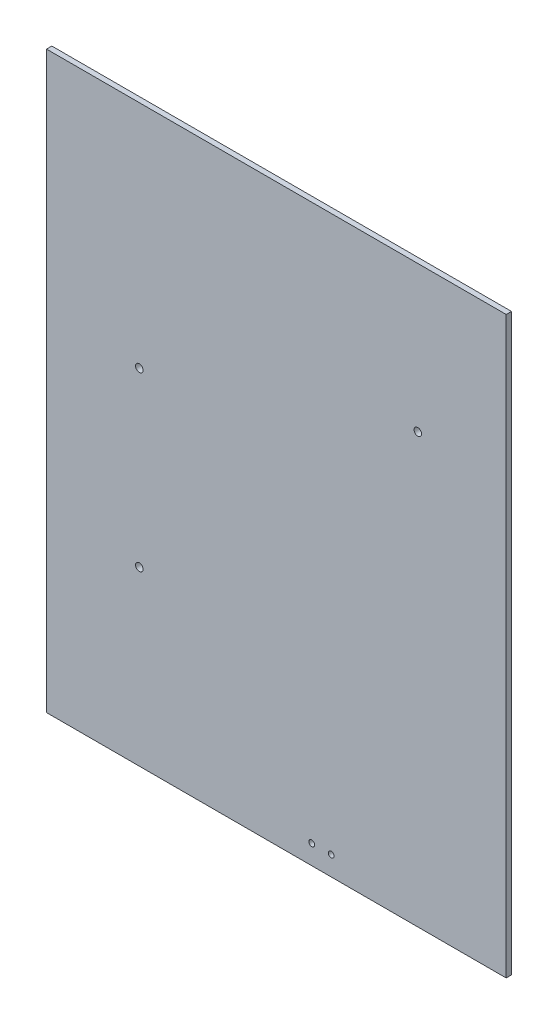
ISO-10303-21;
HEADER;
FILE_DESCRIPTION(('STEP AP214'),'2;1');
FILE_NAME('part.step','',(''),(''),'','','');
FILE_SCHEMA(('AUTOMOTIVE_DESIGN { 1 0 10303 214 1 1 1 1 }'));
ENDSEC;
DATA;
#1=APPLICATION_CONTEXT('core data for automotive mechanical design processes');
#2=APPLICATION_PROTOCOL_DEFINITION('international standard','automotive_design',2000,#1);
#3=PRODUCT_CONTEXT('',#1,'mechanical');
#4=PRODUCT('Part','Part','',(#3));
#5=PRODUCT_RELATED_PRODUCT_CATEGORY('part','',(#4));
#6=PRODUCT_DEFINITION_FORMATION('','',#4);
#7=PRODUCT_DEFINITION_CONTEXT('part definition',#1,'design');
#8=PRODUCT_DEFINITION('design','',#6,#7);
#9=PRODUCT_DEFINITION_SHAPE('','',#8);
#10=(LENGTH_UNIT() NAMED_UNIT(*) SI_UNIT(.MILLI.,.METRE.));
#11=(NAMED_UNIT(*) PLANE_ANGLE_UNIT() SI_UNIT($,.RADIAN.));
#12=(NAMED_UNIT(*) SI_UNIT($,.STERADIAN.) SOLID_ANGLE_UNIT());
#13=UNCERTAINTY_MEASURE_WITH_UNIT(LENGTH_MEASURE(1.E-05),#10,'distance_accuracy_value','');
#14=(GEOMETRIC_REPRESENTATION_CONTEXT(3) GLOBAL_UNCERTAINTY_ASSIGNED_CONTEXT((#13)) GLOBAL_UNIT_ASSIGNED_CONTEXT((#10,
#11,#12)) REPRESENTATION_CONTEXT('',''));
#15=CARTESIAN_POINT('',(0.,0.,0.));
#16=DIRECTION('',(0.,0.,1.));
#17=DIRECTION('',(1.,0.,0.));
#18=AXIS2_PLACEMENT_3D('',#15,#16,#17);
#19=CARTESIAN_POINT('',(0.,0.,6.));
#20=DIRECTION('',(1.,0.,0.));
#21=DIRECTION('',(0.,0.,-1.));
#22=AXIS2_PLACEMENT_3D('',#19,#20,#21);
#23=PLANE('',#22);
#24=DIRECTION('',(0.,-1.,0.));
#25=VECTOR('',#24,1.);
#26=CARTESIAN_POINT('',(0.,0.,0.));
#27=LINE('',#26,#25);
#28=CARTESIAN_POINT('',(0.,650.,0.));
#29=VERTEX_POINT('',#28);
#30=CARTESIAN_POINT('',(0.,0.,0.));
#31=VERTEX_POINT('',#30);
#32=EDGE_CURVE('E77',#29,#31,#27,.T.);
#33=ORIENTED_EDGE('',*,*,#32,.T.);
#34=DIRECTION('',(0.,0.,-1.));
#35=VECTOR('',#34,1.);
#36=CARTESIAN_POINT('',(0.,0.,6.));
#37=LINE('',#36,#35);
#38=CARTESIAN_POINT('',(0.,0.,6.));
#39=VERTEX_POINT('',#38);
#40=EDGE_CURVE('E11',#39,#31,#37,.T.);
#41=ORIENTED_EDGE('',*,*,#40,.F.);
#42=DIRECTION('',(0.,-1.,0.));
#43=VECTOR('',#42,1.);
#44=CARTESIAN_POINT('',(0.,0.,6.));
#45=LINE('',#44,#43);
#46=CARTESIAN_POINT('',(0.,650.,6.));
#47=VERTEX_POINT('',#46);
#48=EDGE_CURVE('E100',#47,#39,#45,.T.);
#49=ORIENTED_EDGE('',*,*,#48,.F.);
#50=DIRECTION('',(0.,0.,-1.));
#51=VECTOR('',#50,1.);
#52=CARTESIAN_POINT('',(0.,650.,6.));
#53=LINE('',#52,#51);
#54=EDGE_CURVE('E89',#47,#29,#53,.T.);
#55=ORIENTED_EDGE('',*,*,#54,.T.);
#56=EDGE_LOOP('',(#33,#41,#49,#55));
#57=FACE_BOUND('',#56,.T.);
#58=ADVANCED_FACE('F33',(#57),#23,.F.);
#59=CARTESIAN_POINT('',(0.,0.,6.));
#60=DIRECTION('',(0.,1.,0.));
#61=DIRECTION('',(0.,0.,1.));
#62=AXIS2_PLACEMENT_3D('',#59,#60,#61);
#63=PLANE('',#62);
#64=DIRECTION('',(1.,0.,0.));
#65=VECTOR('',#64,1.);
#66=CARTESIAN_POINT('',(0.,0.,0.));
#67=LINE('',#66,#65);
#68=CARTESIAN_POINT('',(520.,0.,0.));
#69=VERTEX_POINT('',#68);
#70=EDGE_CURVE('E73',#31,#69,#67,.T.);
#71=ORIENTED_EDGE('',*,*,#70,.T.);
#72=DIRECTION('',(0.,0.,-1.));
#73=VECTOR('',#72,1.);
#74=CARTESIAN_POINT('',(520.,0.,6.));
#75=LINE('',#74,#73);
#76=CARTESIAN_POINT('',(520.,0.,6.));
#77=VERTEX_POINT('',#76);
#78=EDGE_CURVE('E40',#77,#69,#75,.T.);
#79=ORIENTED_EDGE('',*,*,#78,.F.);
#80=DIRECTION('',(1.,0.,0.));
#81=VECTOR('',#80,1.);
#82=CARTESIAN_POINT('',(0.,0.,6.));
#83=LINE('',#82,#81);
#84=EDGE_CURVE('E85',#39,#77,#83,.T.);
#85=ORIENTED_EDGE('',*,*,#84,.F.);
#86=ORIENTED_EDGE('',*,*,#40,.T.);
#87=EDGE_LOOP('',(#71,#79,#85,#86));
#88=FACE_BOUND('',#87,.T.);
#89=ADVANCED_FACE('F84',(#88),#63,.F.);
#90=CARTESIAN_POINT('',(520.,0.,6.));
#91=DIRECTION('',(-1.,0.,0.));
#92=DIRECTION('',(0.,0.,1.));
#93=AXIS2_PLACEMENT_3D('',#90,#91,#92);
#94=PLANE('',#93);
#95=DIRECTION('',(0.,1.,0.));
#96=VECTOR('',#95,1.);
#97=CARTESIAN_POINT('',(520.,0.,0.));
#98=LINE('',#97,#96);
#99=CARTESIAN_POINT('',(520.,650.,0.));
#100=VERTEX_POINT('',#99);
#101=EDGE_CURVE('E78',#69,#100,#98,.T.);
#102=ORIENTED_EDGE('',*,*,#101,.T.);
#103=DIRECTION('',(0.,0.,-1.));
#104=VECTOR('',#103,1.);
#105=CARTESIAN_POINT('',(520.,650.,6.));
#106=LINE('',#105,#104);
#107=CARTESIAN_POINT('',(520.,650.,6.));
#108=VERTEX_POINT('',#107);
#109=EDGE_CURVE('E106',#108,#100,#106,.T.);
#110=ORIENTED_EDGE('',*,*,#109,.F.);
#111=DIRECTION('',(0.,1.,0.));
#112=VECTOR('',#111,1.);
#113=CARTESIAN_POINT('',(520.,0.,6.));
#114=LINE('',#113,#112);
#115=EDGE_CURVE('E52',#77,#108,#114,.T.);
#116=ORIENTED_EDGE('',*,*,#115,.F.);
#117=ORIENTED_EDGE('',*,*,#78,.T.);
#118=EDGE_LOOP('',(#102,#110,#116,#117));
#119=FACE_BOUND('',#118,.T.);
#120=ADVANCED_FACE('F109',(#119),#94,.F.);
#121=CARTESIAN_POINT('',(0.,650.,6.));
#122=DIRECTION('',(0.,-1.,0.));
#123=DIRECTION('',(0.,0.,-1.));
#124=AXIS2_PLACEMENT_3D('',#121,#122,#123);
#125=PLANE('',#124);
#126=DIRECTION('',(-1.,0.,0.));
#127=VECTOR('',#126,1.);
#128=CARTESIAN_POINT('',(0.,650.,0.));
#129=LINE('',#128,#127);
#130=EDGE_CURVE('E98',#100,#29,#129,.T.);
#131=ORIENTED_EDGE('',*,*,#130,.T.);
#132=ORIENTED_EDGE('',*,*,#54,.F.);
#133=DIRECTION('',(-1.,0.,0.));
#134=VECTOR('',#133,1.);
#135=CARTESIAN_POINT('',(0.,650.,6.));
#136=LINE('',#135,#134);
#137=EDGE_CURVE('E47',#108,#47,#136,.T.);
#138=ORIENTED_EDGE('',*,*,#137,.F.);
#139=ORIENTED_EDGE('',*,*,#109,.T.);
#140=EDGE_LOOP('',(#131,#132,#138,#139));
#141=FACE_BOUND('',#140,.T.);
#142=ADVANCED_FACE('F111',(#141),#125,.F.);
#143=CARTESIAN_POINT('',(0.,650.,6.));
#144=DIRECTION('',(0.,0.,-1.));
#145=DIRECTION('',(-1.,0.,0.));
#146=AXIS2_PLACEMENT_3D('',#143,#144,#145);
#147=PLANE('',#146);
#148=CARTESIAN_POINT('',(322.,22.,6.));
#149=DIRECTION('',(0.,0.,1.));
#150=DIRECTION('',(1.,0.,0.));
#151=AXIS2_PLACEMENT_3D('',#148,#149,#150);
#152=CIRCLE('',#151,3.24999999999995);
#153=CARTESIAN_POINT('',(325.25,22.,6.));
#154=VERTEX_POINT('',#153);
#155=EDGE_CURVE('E208',#154,#154,#152,.T.);
#156=ORIENTED_EDGE('',*,*,#155,.F.);
#157=EDGE_LOOP('',(#156));
#158=FACE_BOUND('',#157,.T.);
#159=CARTESIAN_POINT('',(300.,22.,6.));
#160=DIRECTION('',(0.,0.,1.));
#161=DIRECTION('',(1.,0.,0.));
#162=AXIS2_PLACEMENT_3D('',#159,#160,#161);
#163=CIRCLE('',#162,3.25000000000001);
#164=CARTESIAN_POINT('',(303.25,22.,6.));
#165=VERTEX_POINT('',#164);
#166=EDGE_CURVE('E212',#165,#165,#163,.T.);
#167=ORIENTED_EDGE('',*,*,#166,.F.);
#168=EDGE_LOOP('',(#167));
#169=FACE_BOUND('',#168,.T.);
#170=CARTESIAN_POINT('',(105.,195.,6.));
#171=DIRECTION('',(0.,0.,1.));
#172=DIRECTION('',(1.,0.,0.));
#173=AXIS2_PLACEMENT_3D('',#170,#171,#172);
#174=CIRCLE('',#173,4.25000000000001);
#175=CARTESIAN_POINT('',(109.25,195.,6.));
#176=VERTEX_POINT('',#175);
#177=EDGE_CURVE('E219',#176,#176,#174,.T.);
#178=ORIENTED_EDGE('',*,*,#177,.F.);
#179=EDGE_LOOP('',(#178));
#180=FACE_BOUND('',#179,.T.);
#181=CARTESIAN_POINT('',(105.,390.,6.));
#182=DIRECTION('',(0.,0.,1.));
#183=DIRECTION('',(1.,0.,0.));
#184=AXIS2_PLACEMENT_3D('',#181,#182,#183);
#185=CIRCLE('',#184,4.24999999999998);
#186=CARTESIAN_POINT('',(109.25,390.,6.));
#187=VERTEX_POINT('',#186);
#188=EDGE_CURVE('E225',#187,#187,#185,.T.);
#189=ORIENTED_EDGE('',*,*,#188,.F.);
#190=EDGE_LOOP('',(#189));
#191=FACE_BOUND('',#190,.T.);
#192=CARTESIAN_POINT('',(420.,485.,6.));
#193=DIRECTION('',(0.,0.,1.));
#194=DIRECTION('',(1.,0.,0.));
#195=AXIS2_PLACEMENT_3D('',#192,#193,#194);
#196=CIRCLE('',#195,4.24999999999995);
#197=CARTESIAN_POINT('',(424.25,485.,6.));
#198=VERTEX_POINT('',#197);
#199=EDGE_CURVE('E90',#198,#198,#196,.T.);
#200=ORIENTED_EDGE('',*,*,#199,.F.);
#201=EDGE_LOOP('',(#200));
#202=FACE_BOUND('',#201,.T.);
#203=ORIENTED_EDGE('',*,*,#48,.T.);
#204=ORIENTED_EDGE('',*,*,#84,.T.);
#205=ORIENTED_EDGE('',*,*,#115,.T.);
#206=ORIENTED_EDGE('',*,*,#137,.T.);
#207=EDGE_LOOP('',(#203,#204,#205,#206));
#208=FACE_BOUND('',#207,.T.);
#209=ADVANCED_FACE('F112',(#158,#169,#180,#191,#202,#208),#147,.F.);
#210=CARTESIAN_POINT('',(0.,650.,0.));
#211=DIRECTION('',(0.,0.,-1.));
#212=DIRECTION('',(-1.,0.,0.));
#213=AXIS2_PLACEMENT_3D('',#210,#211,#212);
#214=PLANE('',#213);
#215=CARTESIAN_POINT('',(322.,22.,0.));
#216=DIRECTION('',(0.,0.,-1.));
#217=DIRECTION('',(-1.,0.,0.));
#218=AXIS2_PLACEMENT_3D('',#215,#216,#217);
#219=CIRCLE('',#218,3.24999999999995);
#220=CARTESIAN_POINT('',(325.25,22.,0.));
#221=VERTEX_POINT('',#220);
#222=EDGE_CURVE('E206',#221,#221,#219,.F.);
#223=ORIENTED_EDGE('',*,*,#222,.T.);
#224=EDGE_LOOP('',(#223));
#225=FACE_BOUND('',#224,.T.);
#226=CARTESIAN_POINT('',(300.,22.,0.));
#227=DIRECTION('',(0.,0.,-1.));
#228=DIRECTION('',(-1.,0.,0.));
#229=AXIS2_PLACEMENT_3D('',#226,#227,#228);
#230=CIRCLE('',#229,3.25000000000001);
#231=CARTESIAN_POINT('',(303.25,22.,0.));
#232=VERTEX_POINT('',#231);
#233=EDGE_CURVE('E209',#232,#232,#230,.F.);
#234=ORIENTED_EDGE('',*,*,#233,.T.);
#235=EDGE_LOOP('',(#234));
#236=FACE_BOUND('',#235,.T.);
#237=CARTESIAN_POINT('',(105.,195.,0.));
#238=DIRECTION('',(0.,0.,-1.));
#239=DIRECTION('',(-1.,0.,0.));
#240=AXIS2_PLACEMENT_3D('',#237,#238,#239);
#241=CIRCLE('',#240,4.25000000000001);
#242=CARTESIAN_POINT('',(109.25,195.,0.));
#243=VERTEX_POINT('',#242);
#244=EDGE_CURVE('E217',#243,#243,#241,.F.);
#245=ORIENTED_EDGE('',*,*,#244,.T.);
#246=EDGE_LOOP('',(#245));
#247=FACE_BOUND('',#246,.T.);
#248=CARTESIAN_POINT('',(105.,390.,0.));
#249=DIRECTION('',(0.,0.,-1.));
#250=DIRECTION('',(-1.,0.,0.));
#251=AXIS2_PLACEMENT_3D('',#248,#249,#250);
#252=CIRCLE('',#251,4.24999999999998);
#253=CARTESIAN_POINT('',(109.25,390.,0.));
#254=VERTEX_POINT('',#253);
#255=EDGE_CURVE('E222',#254,#254,#252,.F.);
#256=ORIENTED_EDGE('',*,*,#255,.T.);
#257=EDGE_LOOP('',(#256));
#258=FACE_BOUND('',#257,.T.);
#259=CARTESIAN_POINT('',(420.,485.,0.));
#260=DIRECTION('',(0.,0.,-1.));
#261=DIRECTION('',(-1.,0.,0.));
#262=AXIS2_PLACEMENT_3D('',#259,#260,#261);
#263=CIRCLE('',#262,4.24999999999995);
#264=CARTESIAN_POINT('',(424.25,485.,0.));
#265=VERTEX_POINT('',#264);
#266=EDGE_CURVE('E93',#265,#265,#263,.F.);
#267=ORIENTED_EDGE('',*,*,#266,.T.);
#268=EDGE_LOOP('',(#267));
#269=FACE_BOUND('',#268,.T.);
#270=ORIENTED_EDGE('',*,*,#32,.F.);
#271=ORIENTED_EDGE('',*,*,#130,.F.);
#272=ORIENTED_EDGE('',*,*,#101,.F.);
#273=ORIENTED_EDGE('',*,*,#70,.F.);
#274=EDGE_LOOP('',(#270,#271,#272,#273));
#275=FACE_BOUND('',#274,.T.);
#276=ADVANCED_FACE('F74',(#225,#236,#247,#258,#269,#275),#214,.T.);
#277=CARTESIAN_POINT('',(420.,485.,-0.00100000000000013));
#278=DIRECTION('',(0.,0.,1.));
#279=DIRECTION('',(1.,0.,0.));
#280=AXIS2_PLACEMENT_3D('',#277,#278,#279);
#281=CYLINDRICAL_SURFACE('',#280,4.24999999999995);
#282=CARTESIAN_POINT('',(424.25,485.,0.));
#283=CARTESIAN_POINT('',(424.25,485.,0.0624999999999999));
#284=CARTESIAN_POINT('',(424.25,485.,0.125));
#285=CARTESIAN_POINT('',(424.25,485.,0.25));
#286=CARTESIAN_POINT('',(424.25,485.,0.3125));
#287=CARTESIAN_POINT('',(424.25,485.,0.4375));
#288=CARTESIAN_POINT('',(424.25,485.,0.5));
#289=CARTESIAN_POINT('',(424.25,485.,0.625));
#290=CARTESIAN_POINT('',(424.25,485.,0.6875));
#291=CARTESIAN_POINT('',(424.25,485.,0.8125));
#292=CARTESIAN_POINT('',(424.25,485.,0.875));
#293=CARTESIAN_POINT('',(424.25,485.,1.));
#294=CARTESIAN_POINT('',(424.25,485.,1.0625));
#295=CARTESIAN_POINT('',(424.25,485.,1.1875));
#296=CARTESIAN_POINT('',(424.25,485.,1.25));
#297=CARTESIAN_POINT('',(424.25,485.,1.375));
#298=CARTESIAN_POINT('',(424.25,485.,1.4375));
#299=CARTESIAN_POINT('',(424.25,485.,1.5625));
#300=CARTESIAN_POINT('',(424.25,485.,1.625));
#301=CARTESIAN_POINT('',(424.25,485.,1.75));
#302=CARTESIAN_POINT('',(424.25,485.,1.8125));
#303=CARTESIAN_POINT('',(424.25,485.,1.9375));
#304=CARTESIAN_POINT('',(424.25,485.,2.));
#305=CARTESIAN_POINT('',(424.25,485.,2.125));
#306=CARTESIAN_POINT('',(424.25,485.,2.1875));
#307=CARTESIAN_POINT('',(424.25,485.,2.3125));
#308=CARTESIAN_POINT('',(424.25,485.,2.375));
#309=CARTESIAN_POINT('',(424.25,485.,2.5));
#310=CARTESIAN_POINT('',(424.25,485.,2.5625));
#311=CARTESIAN_POINT('',(424.25,485.,2.6875));
#312=CARTESIAN_POINT('',(424.25,485.,2.75));
#313=CARTESIAN_POINT('',(424.25,485.,2.875));
#314=CARTESIAN_POINT('',(424.25,485.,2.9375));
#315=CARTESIAN_POINT('',(424.25,485.,3.0625));
#316=CARTESIAN_POINT('',(424.25,485.,3.125));
#317=CARTESIAN_POINT('',(424.25,485.,3.25));
#318=CARTESIAN_POINT('',(424.25,485.,3.3125));
#319=CARTESIAN_POINT('',(424.25,485.,3.4375));
#320=CARTESIAN_POINT('',(424.25,485.,3.5));
#321=CARTESIAN_POINT('',(424.25,485.,3.625));
#322=CARTESIAN_POINT('',(424.25,485.,3.6875));
#323=CARTESIAN_POINT('',(424.25,485.,3.8125));
#324=CARTESIAN_POINT('',(424.25,485.,3.875));
#325=CARTESIAN_POINT('',(424.25,485.,4.));
#326=CARTESIAN_POINT('',(424.25,485.,4.0625));
#327=CARTESIAN_POINT('',(424.25,485.,4.1875));
#328=CARTESIAN_POINT('',(424.25,485.,4.25));
#329=CARTESIAN_POINT('',(424.25,485.,4.375));
#330=CARTESIAN_POINT('',(424.25,485.,4.4375));
#331=CARTESIAN_POINT('',(424.25,485.,4.5625));
#332=CARTESIAN_POINT('',(424.25,485.,4.625));
#333=CARTESIAN_POINT('',(424.25,485.,4.75));
#334=CARTESIAN_POINT('',(424.25,485.,4.8125));
#335=CARTESIAN_POINT('',(424.25,485.,4.9375));
#336=CARTESIAN_POINT('',(424.25,485.,5.));
#337=CARTESIAN_POINT('',(424.25,485.,5.125));
#338=CARTESIAN_POINT('',(424.25,485.,5.1875));
#339=CARTESIAN_POINT('',(424.25,485.,5.3125));
#340=CARTESIAN_POINT('',(424.25,485.,5.375));
#341=CARTESIAN_POINT('',(424.25,485.,5.5));
#342=CARTESIAN_POINT('',(424.25,485.,5.5625));
#343=CARTESIAN_POINT('',(424.25,485.,5.6875));
#344=CARTESIAN_POINT('',(424.25,485.,5.75));
#345=CARTESIAN_POINT('',(424.25,485.,5.875));
#346=CARTESIAN_POINT('',(424.25,485.,5.9375));
#347=CARTESIAN_POINT('',(424.25,485.,6.));
#348=B_SPLINE_CURVE_WITH_KNOTS('',3,(#282,#283,#284,#285,#286,#287,#288,#289,#290,#291,#292,
#293,#294,#295,#296,#297,#298,#299,#300,#301,#302,#303,#304,#305,#306,#307,#308,#309,#310,#311,
#312,#313,#314,#315,#316,#317,#318,#319,#320,#321,#322,#323,#324,#325,#326,#327,#328,#329,#330,
#331,#332,#333,#334,#335,#336,#337,#338,#339,#340,#341,#342,#343,#344,#345,#346,#347),
.UNSPECIFIED.,.F.,.F.,(4,2,2,2,2,2,2,2,2,2,2,2,2,2,2,2,2,2,2,2,2,2,2,2,2,2,2,2,2,2,2,2,4),(0.,
0.1875,0.375,0.5625,0.75,0.9375,1.125,1.3125,1.5,1.6875,1.875,2.0625,2.25,2.4375,2.625,2.8125,
3.,3.1875,3.375,3.5625,3.75,3.9375,4.125,4.3125,4.5,4.6875,4.875,5.0625,5.25,5.4375,5.625,
5.8125,6.),.UNSPECIFIED.);
#349=EDGE_CURVE('BSEAM120',#265,#198,#348,.T.);
#350=ORIENTED_EDGE('',*,*,#266,.F.);
#351=ORIENTED_EDGE('',*,*,#199,.T.);
#352=ORIENTED_EDGE('',*,*,#349,.T.);
#353=ORIENTED_EDGE('',*,*,#349,.F.);
#354=EDGE_LOOP('',(#350,#352,#351,#353));
#355=FACE_BOUND('',#354,.T.);
#356=ADVANCED_FACE('F120',(#355),#281,.F.);
#357=CARTESIAN_POINT('',(105.,390.,-0.00100000000000013));
#358=DIRECTION('',(0.,0.,1.));
#359=DIRECTION('',(1.,0.,0.));
#360=AXIS2_PLACEMENT_3D('',#357,#358,#359);
#361=CYLINDRICAL_SURFACE('',#360,4.24999999999998);
#362=CARTESIAN_POINT('',(109.25,390.,0.));
#363=CARTESIAN_POINT('',(109.25,390.,0.0624999999999999));
#364=CARTESIAN_POINT('',(109.25,390.,0.125));
#365=CARTESIAN_POINT('',(109.25,390.,0.25));
#366=CARTESIAN_POINT('',(109.25,390.,0.3125));
#367=CARTESIAN_POINT('',(109.25,390.,0.4375));
#368=CARTESIAN_POINT('',(109.25,390.,0.5));
#369=CARTESIAN_POINT('',(109.25,390.,0.625));
#370=CARTESIAN_POINT('',(109.25,390.,0.6875));
#371=CARTESIAN_POINT('',(109.25,390.,0.8125));
#372=CARTESIAN_POINT('',(109.25,390.,0.875));
#373=CARTESIAN_POINT('',(109.25,390.,1.));
#374=CARTESIAN_POINT('',(109.25,390.,1.0625));
#375=CARTESIAN_POINT('',(109.25,390.,1.1875));
#376=CARTESIAN_POINT('',(109.25,390.,1.25));
#377=CARTESIAN_POINT('',(109.25,390.,1.375));
#378=CARTESIAN_POINT('',(109.25,390.,1.4375));
#379=CARTESIAN_POINT('',(109.25,390.,1.5625));
#380=CARTESIAN_POINT('',(109.25,390.,1.625));
#381=CARTESIAN_POINT('',(109.25,390.,1.75));
#382=CARTESIAN_POINT('',(109.25,390.,1.8125));
#383=CARTESIAN_POINT('',(109.25,390.,1.9375));
#384=CARTESIAN_POINT('',(109.25,390.,2.));
#385=CARTESIAN_POINT('',(109.25,390.,2.125));
#386=CARTESIAN_POINT('',(109.25,390.,2.1875));
#387=CARTESIAN_POINT('',(109.25,390.,2.3125));
#388=CARTESIAN_POINT('',(109.25,390.,2.375));
#389=CARTESIAN_POINT('',(109.25,390.,2.5));
#390=CARTESIAN_POINT('',(109.25,390.,2.5625));
#391=CARTESIAN_POINT('',(109.25,390.,2.6875));
#392=CARTESIAN_POINT('',(109.25,390.,2.75));
#393=CARTESIAN_POINT('',(109.25,390.,2.875));
#394=CARTESIAN_POINT('',(109.25,390.,2.9375));
#395=CARTESIAN_POINT('',(109.25,390.,3.0625));
#396=CARTESIAN_POINT('',(109.25,390.,3.125));
#397=CARTESIAN_POINT('',(109.25,390.,3.25));
#398=CARTESIAN_POINT('',(109.25,390.,3.3125));
#399=CARTESIAN_POINT('',(109.25,390.,3.4375));
#400=CARTESIAN_POINT('',(109.25,390.,3.5));
#401=CARTESIAN_POINT('',(109.25,390.,3.625));
#402=CARTESIAN_POINT('',(109.25,390.,3.6875));
#403=CARTESIAN_POINT('',(109.25,390.,3.8125));
#404=CARTESIAN_POINT('',(109.25,390.,3.875));
#405=CARTESIAN_POINT('',(109.25,390.,4.));
#406=CARTESIAN_POINT('',(109.25,390.,4.0625));
#407=CARTESIAN_POINT('',(109.25,390.,4.1875));
#408=CARTESIAN_POINT('',(109.25,390.,4.25));
#409=CARTESIAN_POINT('',(109.25,390.,4.375));
#410=CARTESIAN_POINT('',(109.25,390.,4.4375));
#411=CARTESIAN_POINT('',(109.25,390.,4.5625));
#412=CARTESIAN_POINT('',(109.25,390.,4.625));
#413=CARTESIAN_POINT('',(109.25,390.,4.75));
#414=CARTESIAN_POINT('',(109.25,390.,4.8125));
#415=CARTESIAN_POINT('',(109.25,390.,4.9375));
#416=CARTESIAN_POINT('',(109.25,390.,5.));
#417=CARTESIAN_POINT('',(109.25,390.,5.125));
#418=CARTESIAN_POINT('',(109.25,390.,5.1875));
#419=CARTESIAN_POINT('',(109.25,390.,5.3125));
#420=CARTESIAN_POINT('',(109.25,390.,5.375));
#421=CARTESIAN_POINT('',(109.25,390.,5.5));
#422=CARTESIAN_POINT('',(109.25,390.,5.5625));
#423=CARTESIAN_POINT('',(109.25,390.,5.6875));
#424=CARTESIAN_POINT('',(109.25,390.,5.75));
#425=CARTESIAN_POINT('',(109.25,390.,5.875));
#426=CARTESIAN_POINT('',(109.25,390.,5.9375));
#427=CARTESIAN_POINT('',(109.25,390.,6.));
#428=B_SPLINE_CURVE_WITH_KNOTS('',3,(#362,#363,#364,#365,#366,#367,#368,#369,#370,#371,#372,
#373,#374,#375,#376,#377,#378,#379,#380,#381,#382,#383,#384,#385,#386,#387,#388,#389,#390,#391,
#392,#393,#394,#395,#396,#397,#398,#399,#400,#401,#402,#403,#404,#405,#406,#407,#408,#409,#410,
#411,#412,#413,#414,#415,#416,#417,#418,#419,#420,#421,#422,#423,#424,#425,#426,#427),
.UNSPECIFIED.,.F.,.F.,(4,2,2,2,2,2,2,2,2,2,2,2,2,2,2,2,2,2,2,2,2,2,2,2,2,2,2,2,2,2,2,2,4),(0.,
0.1875,0.375,0.5625,0.75,0.9375,1.125,1.3125,1.5,1.6875,1.875,2.0625,2.25,2.4375,2.625,2.8125,
3.,3.1875,3.375,3.5625,3.75,3.9375,4.125,4.3125,4.5,4.6875,4.875,5.0625,5.25,5.4375,5.625,
5.8125,6.),.UNSPECIFIED.);
#429=EDGE_CURVE('BSEAM159',#254,#187,#428,.T.);
#430=ORIENTED_EDGE('',*,*,#255,.F.);
#431=ORIENTED_EDGE('',*,*,#188,.T.);
#432=ORIENTED_EDGE('',*,*,#429,.T.);
#433=ORIENTED_EDGE('',*,*,#429,.F.);
#434=EDGE_LOOP('',(#430,#432,#431,#433));
#435=FACE_BOUND('',#434,.T.);
#436=ADVANCED_FACE('F159',(#435),#361,.F.);
#437=CARTESIAN_POINT('',(105.,195.,-0.00100000000000013));
#438=DIRECTION('',(0.,0.,1.));
#439=DIRECTION('',(1.,0.,0.));
#440=AXIS2_PLACEMENT_3D('',#437,#438,#439);
#441=CYLINDRICAL_SURFACE('',#440,4.25000000000001);
#442=CARTESIAN_POINT('',(109.25,195.,0.));
#443=CARTESIAN_POINT('',(109.25,195.,0.0624999999999999));
#444=CARTESIAN_POINT('',(109.25,195.,0.125));
#445=CARTESIAN_POINT('',(109.25,195.,0.25));
#446=CARTESIAN_POINT('',(109.25,195.,0.3125));
#447=CARTESIAN_POINT('',(109.25,195.,0.4375));
#448=CARTESIAN_POINT('',(109.25,195.,0.5));
#449=CARTESIAN_POINT('',(109.25,195.,0.625));
#450=CARTESIAN_POINT('',(109.25,195.,0.6875));
#451=CARTESIAN_POINT('',(109.25,195.,0.8125));
#452=CARTESIAN_POINT('',(109.25,195.,0.875));
#453=CARTESIAN_POINT('',(109.25,195.,1.));
#454=CARTESIAN_POINT('',(109.25,195.,1.0625));
#455=CARTESIAN_POINT('',(109.25,195.,1.1875));
#456=CARTESIAN_POINT('',(109.25,195.,1.25));
#457=CARTESIAN_POINT('',(109.25,195.,1.375));
#458=CARTESIAN_POINT('',(109.25,195.,1.4375));
#459=CARTESIAN_POINT('',(109.25,195.,1.5625));
#460=CARTESIAN_POINT('',(109.25,195.,1.625));
#461=CARTESIAN_POINT('',(109.25,195.,1.75));
#462=CARTESIAN_POINT('',(109.25,195.,1.8125));
#463=CARTESIAN_POINT('',(109.25,195.,1.9375));
#464=CARTESIAN_POINT('',(109.25,195.,2.));
#465=CARTESIAN_POINT('',(109.25,195.,2.125));
#466=CARTESIAN_POINT('',(109.25,195.,2.1875));
#467=CARTESIAN_POINT('',(109.25,195.,2.3125));
#468=CARTESIAN_POINT('',(109.25,195.,2.375));
#469=CARTESIAN_POINT('',(109.25,195.,2.5));
#470=CARTESIAN_POINT('',(109.25,195.,2.5625));
#471=CARTESIAN_POINT('',(109.25,195.,2.6875));
#472=CARTESIAN_POINT('',(109.25,195.,2.75));
#473=CARTESIAN_POINT('',(109.25,195.,2.875));
#474=CARTESIAN_POINT('',(109.25,195.,2.9375));
#475=CARTESIAN_POINT('',(109.25,195.,3.0625));
#476=CARTESIAN_POINT('',(109.25,195.,3.125));
#477=CARTESIAN_POINT('',(109.25,195.,3.25));
#478=CARTESIAN_POINT('',(109.25,195.,3.3125));
#479=CARTESIAN_POINT('',(109.25,195.,3.4375));
#480=CARTESIAN_POINT('',(109.25,195.,3.5));
#481=CARTESIAN_POINT('',(109.25,195.,3.625));
#482=CARTESIAN_POINT('',(109.25,195.,3.6875));
#483=CARTESIAN_POINT('',(109.25,195.,3.8125));
#484=CARTESIAN_POINT('',(109.25,195.,3.875));
#485=CARTESIAN_POINT('',(109.25,195.,4.));
#486=CARTESIAN_POINT('',(109.25,195.,4.0625));
#487=CARTESIAN_POINT('',(109.25,195.,4.1875));
#488=CARTESIAN_POINT('',(109.25,195.,4.25));
#489=CARTESIAN_POINT('',(109.25,195.,4.375));
#490=CARTESIAN_POINT('',(109.25,195.,4.4375));
#491=CARTESIAN_POINT('',(109.25,195.,4.5625));
#492=CARTESIAN_POINT('',(109.25,195.,4.625));
#493=CARTESIAN_POINT('',(109.25,195.,4.75));
#494=CARTESIAN_POINT('',(109.25,195.,4.8125));
#495=CARTESIAN_POINT('',(109.25,195.,4.9375));
#496=CARTESIAN_POINT('',(109.25,195.,5.));
#497=CARTESIAN_POINT('',(109.25,195.,5.125));
#498=CARTESIAN_POINT('',(109.25,195.,5.1875));
#499=CARTESIAN_POINT('',(109.25,195.,5.3125));
#500=CARTESIAN_POINT('',(109.25,195.,5.375));
#501=CARTESIAN_POINT('',(109.25,195.,5.5));
#502=CARTESIAN_POINT('',(109.25,195.,5.5625));
#503=CARTESIAN_POINT('',(109.25,195.,5.6875));
#504=CARTESIAN_POINT('',(109.25,195.,5.75));
#505=CARTESIAN_POINT('',(109.25,195.,5.875));
#506=CARTESIAN_POINT('',(109.25,195.,5.9375));
#507=CARTESIAN_POINT('',(109.25,195.,6.));
#508=B_SPLINE_CURVE_WITH_KNOTS('',3,(#442,#443,#444,#445,#446,#447,#448,#449,#450,#451,#452,
#453,#454,#455,#456,#457,#458,#459,#460,#461,#462,#463,#464,#465,#466,#467,#468,#469,#470,#471,
#472,#473,#474,#475,#476,#477,#478,#479,#480,#481,#482,#483,#484,#485,#486,#487,#488,#489,#490,
#491,#492,#493,#494,#495,#496,#497,#498,#499,#500,#501,#502,#503,#504,#505,#506,#507),
.UNSPECIFIED.,.F.,.F.,(4,2,2,2,2,2,2,2,2,2,2,2,2,2,2,2,2,2,2,2,2,2,2,2,2,2,2,2,2,2,2,2,4),(0.,
0.1875,0.375,0.5625,0.75,0.9375,1.125,1.3125,1.5,1.6875,1.875,2.0625,2.25,2.4375,2.625,2.8125,
3.,3.1875,3.375,3.5625,3.75,3.9375,4.125,4.3125,4.5,4.6875,4.875,5.0625,5.25,5.4375,5.625,
5.8125,6.),.UNSPECIFIED.);
#509=EDGE_CURVE('BSEAM169',#243,#176,#508,.T.);
#510=ORIENTED_EDGE('',*,*,#244,.F.);
#511=ORIENTED_EDGE('',*,*,#177,.T.);
#512=ORIENTED_EDGE('',*,*,#509,.T.);
#513=ORIENTED_EDGE('',*,*,#509,.F.);
#514=EDGE_LOOP('',(#510,#512,#511,#513));
#515=FACE_BOUND('',#514,.T.);
#516=ADVANCED_FACE('F169',(#515),#441,.F.);
#517=CARTESIAN_POINT('',(300.,22.,-0.00100000000000013));
#518=DIRECTION('',(0.,0.,1.));
#519=DIRECTION('',(1.,0.,0.));
#520=AXIS2_PLACEMENT_3D('',#517,#518,#519);
#521=CYLINDRICAL_SURFACE('',#520,3.25000000000001);
#522=CARTESIAN_POINT('',(303.25,22.,0.));
#523=CARTESIAN_POINT('',(303.25,22.,0.0624999999999999));
#524=CARTESIAN_POINT('',(303.25,22.,0.125));
#525=CARTESIAN_POINT('',(303.25,22.,0.25));
#526=CARTESIAN_POINT('',(303.25,22.,0.3125));
#527=CARTESIAN_POINT('',(303.25,22.,0.4375));
#528=CARTESIAN_POINT('',(303.25,22.,0.5));
#529=CARTESIAN_POINT('',(303.25,22.,0.625));
#530=CARTESIAN_POINT('',(303.25,22.,0.6875));
#531=CARTESIAN_POINT('',(303.25,22.,0.8125));
#532=CARTESIAN_POINT('',(303.25,22.,0.875));
#533=CARTESIAN_POINT('',(303.25,22.,1.));
#534=CARTESIAN_POINT('',(303.25,22.,1.0625));
#535=CARTESIAN_POINT('',(303.25,22.,1.1875));
#536=CARTESIAN_POINT('',(303.25,22.,1.25));
#537=CARTESIAN_POINT('',(303.25,22.,1.375));
#538=CARTESIAN_POINT('',(303.25,22.,1.4375));
#539=CARTESIAN_POINT('',(303.25,22.,1.5625));
#540=CARTESIAN_POINT('',(303.25,22.,1.625));
#541=CARTESIAN_POINT('',(303.25,22.,1.75));
#542=CARTESIAN_POINT('',(303.25,22.,1.8125));
#543=CARTESIAN_POINT('',(303.25,22.,1.9375));
#544=CARTESIAN_POINT('',(303.25,22.,2.));
#545=CARTESIAN_POINT('',(303.25,22.,2.125));
#546=CARTESIAN_POINT('',(303.25,22.,2.1875));
#547=CARTESIAN_POINT('',(303.25,22.,2.3125));
#548=CARTESIAN_POINT('',(303.25,22.,2.375));
#549=CARTESIAN_POINT('',(303.25,22.,2.5));
#550=CARTESIAN_POINT('',(303.25,22.,2.5625));
#551=CARTESIAN_POINT('',(303.25,22.,2.6875));
#552=CARTESIAN_POINT('',(303.25,22.,2.75));
#553=CARTESIAN_POINT('',(303.25,22.,2.875));
#554=CARTESIAN_POINT('',(303.25,22.,2.9375));
#555=CARTESIAN_POINT('',(303.25,22.,3.0625));
#556=CARTESIAN_POINT('',(303.25,22.,3.125));
#557=CARTESIAN_POINT('',(303.25,22.,3.25));
#558=CARTESIAN_POINT('',(303.25,22.,3.3125));
#559=CARTESIAN_POINT('',(303.25,22.,3.4375));
#560=CARTESIAN_POINT('',(303.25,22.,3.5));
#561=CARTESIAN_POINT('',(303.25,22.,3.625));
#562=CARTESIAN_POINT('',(303.25,22.,3.6875));
#563=CARTESIAN_POINT('',(303.25,22.,3.8125));
#564=CARTESIAN_POINT('',(303.25,22.,3.875));
#565=CARTESIAN_POINT('',(303.25,22.,4.));
#566=CARTESIAN_POINT('',(303.25,22.,4.0625));
#567=CARTESIAN_POINT('',(303.25,22.,4.1875));
#568=CARTESIAN_POINT('',(303.25,22.,4.25));
#569=CARTESIAN_POINT('',(303.25,22.,4.375));
#570=CARTESIAN_POINT('',(303.25,22.,4.4375));
#571=CARTESIAN_POINT('',(303.25,22.,4.5625));
#572=CARTESIAN_POINT('',(303.25,22.,4.625));
#573=CARTESIAN_POINT('',(303.25,22.,4.75));
#574=CARTESIAN_POINT('',(303.25,22.,4.8125));
#575=CARTESIAN_POINT('',(303.25,22.,4.9375));
#576=CARTESIAN_POINT('',(303.25,22.,5.));
#577=CARTESIAN_POINT('',(303.25,22.,5.125));
#578=CARTESIAN_POINT('',(303.25,22.,5.1875));
#579=CARTESIAN_POINT('',(303.25,22.,5.3125));
#580=CARTESIAN_POINT('',(303.25,22.,5.375));
#581=CARTESIAN_POINT('',(303.25,22.,5.5));
#582=CARTESIAN_POINT('',(303.25,22.,5.5625));
#583=CARTESIAN_POINT('',(303.25,22.,5.6875));
#584=CARTESIAN_POINT('',(303.25,22.,5.75));
#585=CARTESIAN_POINT('',(303.25,22.,5.875));
#586=CARTESIAN_POINT('',(303.25,22.,5.9375));
#587=CARTESIAN_POINT('',(303.25,22.,6.));
#588=B_SPLINE_CURVE_WITH_KNOTS('',3,(#522,#523,#524,#525,#526,#527,#528,#529,#530,#531,#532,
#533,#534,#535,#536,#537,#538,#539,#540,#541,#542,#543,#544,#545,#546,#547,#548,#549,#550,#551,
#552,#553,#554,#555,#556,#557,#558,#559,#560,#561,#562,#563,#564,#565,#566,#567,#568,#569,#570,
#571,#572,#573,#574,#575,#576,#577,#578,#579,#580,#581,#582,#583,#584,#585,#586,#587),
.UNSPECIFIED.,.F.,.F.,(4,2,2,2,2,2,2,2,2,2,2,2,2,2,2,2,2,2,2,2,2,2,2,2,2,2,2,2,2,2,2,2,4),(0.,
0.1875,0.375,0.5625,0.75,0.9375,1.125,1.3125,1.5,1.6875,1.875,2.0625,2.25,2.4375,2.625,2.8125,
3.,3.1875,3.375,3.5625,3.75,3.9375,4.125,4.3125,4.5,4.6875,4.875,5.0625,5.25,5.4375,5.625,
5.8125,6.),.UNSPECIFIED.);
#589=EDGE_CURVE('BSEAM179',#232,#165,#588,.T.);
#590=ORIENTED_EDGE('',*,*,#233,.F.);
#591=ORIENTED_EDGE('',*,*,#166,.T.);
#592=ORIENTED_EDGE('',*,*,#589,.T.);
#593=ORIENTED_EDGE('',*,*,#589,.F.);
#594=EDGE_LOOP('',(#590,#592,#591,#593));
#595=FACE_BOUND('',#594,.T.);
#596=ADVANCED_FACE('F179',(#595),#521,.F.);
#597=CARTESIAN_POINT('',(322.,22.,-0.00100000000000013));
#598=DIRECTION('',(0.,0.,1.));
#599=DIRECTION('',(1.,0.,0.));
#600=AXIS2_PLACEMENT_3D('',#597,#598,#599);
#601=CYLINDRICAL_SURFACE('',#600,3.24999999999995);
#602=CARTESIAN_POINT('',(325.25,22.,0.));
#603=CARTESIAN_POINT('',(325.25,22.,0.0624999999999999));
#604=CARTESIAN_POINT('',(325.25,22.,0.125));
#605=CARTESIAN_POINT('',(325.25,22.,0.25));
#606=CARTESIAN_POINT('',(325.25,22.,0.3125));
#607=CARTESIAN_POINT('',(325.25,22.,0.4375));
#608=CARTESIAN_POINT('',(325.25,22.,0.5));
#609=CARTESIAN_POINT('',(325.25,22.,0.625));
#610=CARTESIAN_POINT('',(325.25,22.,0.6875));
#611=CARTESIAN_POINT('',(325.25,22.,0.8125));
#612=CARTESIAN_POINT('',(325.25,22.,0.875));
#613=CARTESIAN_POINT('',(325.25,22.,1.));
#614=CARTESIAN_POINT('',(325.25,22.,1.0625));
#615=CARTESIAN_POINT('',(325.25,22.,1.1875));
#616=CARTESIAN_POINT('',(325.25,22.,1.25));
#617=CARTESIAN_POINT('',(325.25,22.,1.375));
#618=CARTESIAN_POINT('',(325.25,22.,1.4375));
#619=CARTESIAN_POINT('',(325.25,22.,1.5625));
#620=CARTESIAN_POINT('',(325.25,22.,1.625));
#621=CARTESIAN_POINT('',(325.25,22.,1.75));
#622=CARTESIAN_POINT('',(325.25,22.,1.8125));
#623=CARTESIAN_POINT('',(325.25,22.,1.9375));
#624=CARTESIAN_POINT('',(325.25,22.,2.));
#625=CARTESIAN_POINT('',(325.25,22.,2.125));
#626=CARTESIAN_POINT('',(325.25,22.,2.1875));
#627=CARTESIAN_POINT('',(325.25,22.,2.3125));
#628=CARTESIAN_POINT('',(325.25,22.,2.375));
#629=CARTESIAN_POINT('',(325.25,22.,2.5));
#630=CARTESIAN_POINT('',(325.25,22.,2.5625));
#631=CARTESIAN_POINT('',(325.25,22.,2.6875));
#632=CARTESIAN_POINT('',(325.25,22.,2.75));
#633=CARTESIAN_POINT('',(325.25,22.,2.875));
#634=CARTESIAN_POINT('',(325.25,22.,2.9375));
#635=CARTESIAN_POINT('',(325.25,22.,3.0625));
#636=CARTESIAN_POINT('',(325.25,22.,3.125));
#637=CARTESIAN_POINT('',(325.25,22.,3.25));
#638=CARTESIAN_POINT('',(325.25,22.,3.3125));
#639=CARTESIAN_POINT('',(325.25,22.,3.4375));
#640=CARTESIAN_POINT('',(325.25,22.,3.5));
#641=CARTESIAN_POINT('',(325.25,22.,3.625));
#642=CARTESIAN_POINT('',(325.25,22.,3.6875));
#643=CARTESIAN_POINT('',(325.25,22.,3.8125));
#644=CARTESIAN_POINT('',(325.25,22.,3.875));
#645=CARTESIAN_POINT('',(325.25,22.,4.));
#646=CARTESIAN_POINT('',(325.25,22.,4.0625));
#647=CARTESIAN_POINT('',(325.25,22.,4.1875));
#648=CARTESIAN_POINT('',(325.25,22.,4.25));
#649=CARTESIAN_POINT('',(325.25,22.,4.375));
#650=CARTESIAN_POINT('',(325.25,22.,4.4375));
#651=CARTESIAN_POINT('',(325.25,22.,4.5625));
#652=CARTESIAN_POINT('',(325.25,22.,4.625));
#653=CARTESIAN_POINT('',(325.25,22.,4.75));
#654=CARTESIAN_POINT('',(325.25,22.,4.8125));
#655=CARTESIAN_POINT('',(325.25,22.,4.9375));
#656=CARTESIAN_POINT('',(325.25,22.,5.));
#657=CARTESIAN_POINT('',(325.25,22.,5.125));
#658=CARTESIAN_POINT('',(325.25,22.,5.1875));
#659=CARTESIAN_POINT('',(325.25,22.,5.3125));
#660=CARTESIAN_POINT('',(325.25,22.,5.375));
#661=CARTESIAN_POINT('',(325.25,22.,5.5));
#662=CARTESIAN_POINT('',(325.25,22.,5.5625));
#663=CARTESIAN_POINT('',(325.25,22.,5.6875));
#664=CARTESIAN_POINT('',(325.25,22.,5.75));
#665=CARTESIAN_POINT('',(325.25,22.,5.875));
#666=CARTESIAN_POINT('',(325.25,22.,5.9375));
#667=CARTESIAN_POINT('',(325.25,22.,6.));
#668=B_SPLINE_CURVE_WITH_KNOTS('',3,(#602,#603,#604,#605,#606,#607,#608,#609,#610,#611,#612,
#613,#614,#615,#616,#617,#618,#619,#620,#621,#622,#623,#624,#625,#626,#627,#628,#629,#630,#631,
#632,#633,#634,#635,#636,#637,#638,#639,#640,#641,#642,#643,#644,#645,#646,#647,#648,#649,#650,
#651,#652,#653,#654,#655,#656,#657,#658,#659,#660,#661,#662,#663,#664,#665,#666,#667),
.UNSPECIFIED.,.F.,.F.,(4,2,2,2,2,2,2,2,2,2,2,2,2,2,2,2,2,2,2,2,2,2,2,2,2,2,2,2,2,2,2,2,4),(0.,
0.1875,0.375,0.5625,0.75,0.9375,1.125,1.3125,1.5,1.6875,1.875,2.0625,2.25,2.4375,2.625,2.8125,
3.,3.1875,3.375,3.5625,3.75,3.9375,4.125,4.3125,4.5,4.6875,4.875,5.0625,5.25,5.4375,5.625,
5.8125,6.),.UNSPECIFIED.);
#669=EDGE_CURVE('BSEAM189',#221,#154,#668,.T.);
#670=ORIENTED_EDGE('',*,*,#222,.F.);
#671=ORIENTED_EDGE('',*,*,#155,.T.);
#672=ORIENTED_EDGE('',*,*,#669,.T.);
#673=ORIENTED_EDGE('',*,*,#669,.F.);
#674=EDGE_LOOP('',(#670,#672,#671,#673));
#675=FACE_BOUND('',#674,.T.);
#676=ADVANCED_FACE('F189',(#675),#601,.F.);
#677=CLOSED_SHELL('',(#58,#89,#120,#142,#209,#276,#356,#436,#516,#596,#676));
#678=MANIFOLD_SOLID_BREP('B2',#677);
#679=ADVANCED_BREP_SHAPE_REPRESENTATION('',(#18,#678),#14);
#680=SHAPE_DEFINITION_REPRESENTATION(#9,#679);
ENDSEC;
END-ISO-10303-21;
